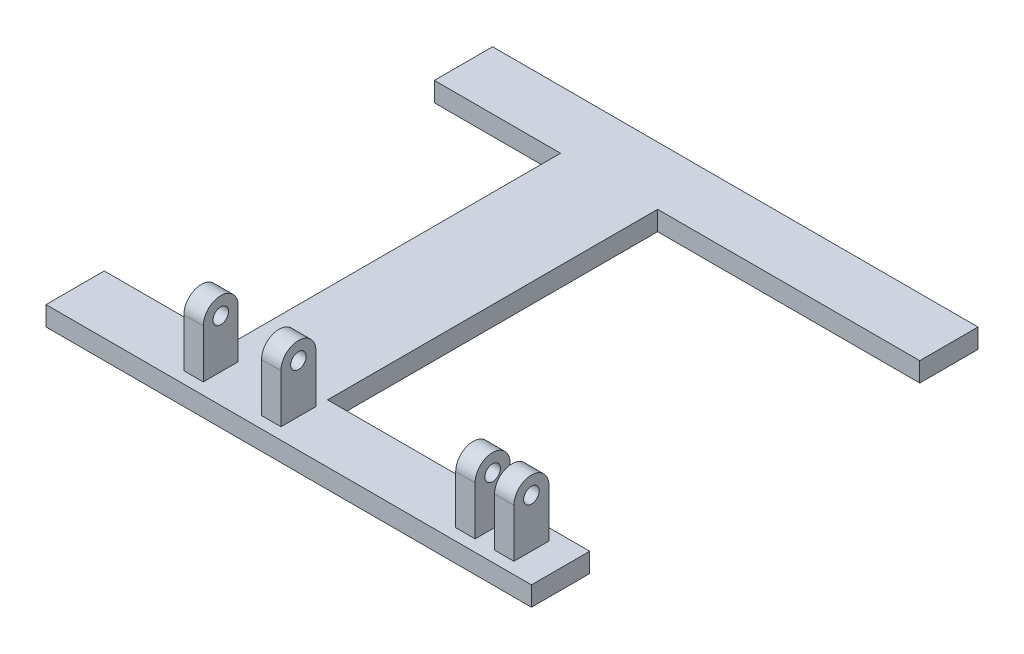
ISO-10303-21;
HEADER;
FILE_DESCRIPTION(('STEP AP214'),'2;1');
FILE_NAME('part.step','',(''),(''),'','','');
FILE_SCHEMA(('AUTOMOTIVE_DESIGN { 1 0 10303 214 1 1 1 1 }'));
ENDSEC;
DATA;
#1=APPLICATION_CONTEXT('core data for automotive mechanical design processes');
#2=APPLICATION_PROTOCOL_DEFINITION('international standard','automotive_design',2000,#1);
#3=PRODUCT_CONTEXT('',#1,'mechanical');
#4=PRODUCT('Part','Part','',(#3));
#5=PRODUCT_RELATED_PRODUCT_CATEGORY('part','',(#4));
#6=PRODUCT_DEFINITION_FORMATION('','',#4);
#7=PRODUCT_DEFINITION_CONTEXT('part definition',#1,'design');
#8=PRODUCT_DEFINITION('design','',#6,#7);
#9=PRODUCT_DEFINITION_SHAPE('','',#8);
#10=(LENGTH_UNIT() NAMED_UNIT(*) SI_UNIT(.MILLI.,.METRE.));
#11=(NAMED_UNIT(*) PLANE_ANGLE_UNIT() SI_UNIT($,.RADIAN.));
#12=(NAMED_UNIT(*) SI_UNIT($,.STERADIAN.) SOLID_ANGLE_UNIT());
#13=UNCERTAINTY_MEASURE_WITH_UNIT(LENGTH_MEASURE(1.E-05),#10,'distance_accuracy_value','');
#14=(GEOMETRIC_REPRESENTATION_CONTEXT(3) GLOBAL_UNCERTAINTY_ASSIGNED_CONTEXT((#13)) GLOBAL_UNIT_ASSIGNED_CONTEXT((#10,
#11,#12)) REPRESENTATION_CONTEXT('',''));
#15=CARTESIAN_POINT('',(0.,0.,0.));
#16=DIRECTION('',(0.,0.,1.));
#17=DIRECTION('',(1.,0.,0.));
#18=AXIS2_PLACEMENT_3D('',#15,#16,#17);
#19=CARTESIAN_POINT('',(0.,10.,0.));
#20=DIRECTION('',(0.,-1.,0.));
#21=DIRECTION('',(0.,0.,-1.));
#22=AXIS2_PLACEMENT_3D('',#19,#20,#21);
#23=PLANE('',#22);
#24=DIRECTION('',(0.,0.,1.));
#25=VECTOR('',#24,1.);
#26=CARTESIAN_POINT('',(90.,10.,115.450830395274));
#27=LINE('',#26,#25);
#28=CARTESIAN_POINT('',(90.,10.,115.450830395274));
#29=VERTEX_POINT('',#28);
#30=CARTESIAN_POINT('',(90.,10.,133.450830395274));
#31=VERTEX_POINT('',#30);
#32=EDGE_CURVE('E278',#29,#31,#27,.T.);
#33=ORIENTED_EDGE('',*,*,#32,.T.);
#34=DIRECTION('',(-1.,0.,0.));
#35=VECTOR('',#34,1.);
#36=CARTESIAN_POINT('',(90.,10.,133.450830395274));
#37=LINE('',#36,#35);
#38=CARTESIAN_POINT('',(80.,10.,133.450830395274));
#39=VERTEX_POINT('',#38);
#40=EDGE_CURVE('E294',#31,#39,#37,.T.);
#41=ORIENTED_EDGE('',*,*,#40,.T.);
#42=DIRECTION('',(0.,0.,1.));
#43=VECTOR('',#42,1.);
#44=CARTESIAN_POINT('',(80.,10.,115.450830395274));
#45=LINE('',#44,#43);
#46=CARTESIAN_POINT('',(80.,10.,115.450830395274));
#47=VERTEX_POINT('',#46);
#48=EDGE_CURVE('E287',#47,#39,#45,.T.);
#49=ORIENTED_EDGE('',*,*,#48,.F.);
#50=DIRECTION('',(-1.,0.,0.));
#51=VECTOR('',#50,1.);
#52=CARTESIAN_POINT('',(90.,10.,115.450830395274));
#53=LINE('',#52,#51);
#54=EDGE_CURVE('E297',#29,#47,#53,.T.);
#55=ORIENTED_EDGE('',*,*,#54,.F.);
#56=EDGE_LOOP('',(#33,#41,#49,#55));
#57=FACE_BOUND('',#56,.T.);
#58=DIRECTION('',(0.,0.,1.));
#59=VECTOR('',#58,1.);
#60=CARTESIAN_POINT('',(-50.,10.,115.450830395274));
#61=LINE('',#60,#59);
#62=CARTESIAN_POINT('',(-50.,10.,115.450830395274));
#63=VERTEX_POINT('',#62);
#64=CARTESIAN_POINT('',(-50.,10.,133.450830395274));
#65=VERTEX_POINT('',#64);
#66=EDGE_CURVE('E351',#63,#65,#61,.T.);
#67=ORIENTED_EDGE('',*,*,#66,.T.);
#68=DIRECTION('',(-1.,0.,0.));
#69=VECTOR('',#68,1.);
#70=CARTESIAN_POINT('',(-50.,10.,133.450830395274));
#71=LINE('',#70,#69);
#72=CARTESIAN_POINT('',(-60.,10.,133.450830395274));
#73=VERTEX_POINT('',#72);
#74=EDGE_CURVE('E369',#65,#73,#71,.T.);
#75=ORIENTED_EDGE('',*,*,#74,.T.);
#76=DIRECTION('',(0.,0.,1.));
#77=VECTOR('',#76,1.);
#78=CARTESIAN_POINT('',(-60.,10.,115.450830395274));
#79=LINE('',#78,#77);
#80=CARTESIAN_POINT('',(-60.,10.,115.450830395274));
#81=VERTEX_POINT('',#80);
#82=EDGE_CURVE('E362',#81,#73,#79,.T.);
#83=ORIENTED_EDGE('',*,*,#82,.F.);
#84=DIRECTION('',(-1.,0.,0.));
#85=VECTOR('',#84,1.);
#86=CARTESIAN_POINT('',(-50.,10.,115.450830395274));
#87=LINE('',#86,#85);
#88=EDGE_CURVE('E372',#63,#81,#87,.T.);
#89=ORIENTED_EDGE('',*,*,#88,.F.);
#90=EDGE_LOOP('',(#67,#75,#83,#89));
#91=FACE_BOUND('',#90,.T.);
#92=DIRECTION('',(0.,0.,1.));
#93=VECTOR('',#92,1.);
#94=CARTESIAN_POINT('',(-125.,10.,-60.5491696047262));
#95=LINE('',#94,#93);
#96=CARTESIAN_POINT('',(-125.,10.,-90.5491696047262));
#97=VERTEX_POINT('',#96);
#98=CARTESIAN_POINT('',(-125.,10.,-60.5491696047262));
#99=VERTEX_POINT('',#98);
#100=EDGE_CURVE('E376',#97,#99,#95,.T.);
#101=ORIENTED_EDGE('',*,*,#100,.T.);
#102=DIRECTION('',(1.,0.,0.));
#103=VECTOR('',#102,1.);
#104=CARTESIAN_POINT('',(-60.,10.,-60.5491696047262));
#105=LINE('',#104,#103);
#106=CARTESIAN_POINT('',(-60.,10.,-60.5491696047262));
#107=VERTEX_POINT('',#106);
#108=EDGE_CURVE('E379',#99,#107,#105,.T.);
#109=ORIENTED_EDGE('',*,*,#108,.T.);
#110=DIRECTION('',(0.,0.,1.));
#111=VECTOR('',#110,1.);
#112=CARTESIAN_POINT('',(-60.,10.,-60.5491696047262));
#113=LINE('',#112,#111);
#114=CARTESIAN_POINT('',(-60.,10.,109.450830395274));
#115=VERTEX_POINT('',#114);
#116=EDGE_CURVE('E382',#107,#115,#113,.T.);
#117=ORIENTED_EDGE('',*,*,#116,.T.);
#118=DIRECTION('',(-1.,0.,0.));
#119=VECTOR('',#118,1.);
#120=CARTESIAN_POINT('',(-125.,10.,109.450830395274));
#121=LINE('',#120,#119);
#122=CARTESIAN_POINT('',(-125.,10.,109.450830395274));
#123=VERTEX_POINT('',#122);
#124=EDGE_CURVE('E384',#115,#123,#121,.T.);
#125=ORIENTED_EDGE('',*,*,#124,.T.);
#126=DIRECTION('',(0.,0.,1.));
#127=VECTOR('',#126,1.);
#128=CARTESIAN_POINT('',(-125.,10.,139.450830395274));
#129=LINE('',#128,#127);
#130=CARTESIAN_POINT('',(-125.,10.,139.450830395274));
#131=VERTEX_POINT('',#130);
#132=EDGE_CURVE('E386',#123,#131,#129,.T.);
#133=ORIENTED_EDGE('',*,*,#132,.T.);
#134=DIRECTION('',(1.,0.,0.));
#135=VECTOR('',#134,1.);
#136=CARTESIAN_POINT('',(125.,10.,139.450830395274));
#137=LINE('',#136,#135);
#138=CARTESIAN_POINT('',(125.,10.,139.450830395274));
#139=VERTEX_POINT('',#138);
#140=EDGE_CURVE('E388',#131,#139,#137,.T.);
#141=ORIENTED_EDGE('',*,*,#140,.T.);
#142=DIRECTION('',(0.,0.,-1.));
#143=VECTOR('',#142,1.);
#144=CARTESIAN_POINT('',(125.,10.,109.450830395274));
#145=LINE('',#144,#143);
#146=CARTESIAN_POINT('',(125.,10.,109.450830395274));
#147=VERTEX_POINT('',#146);
#148=EDGE_CURVE('E390',#139,#147,#145,.T.);
#149=ORIENTED_EDGE('',*,*,#148,.T.);
#150=DIRECTION('',(-1.,0.,0.));
#151=VECTOR('',#150,1.);
#152=CARTESIAN_POINT('',(-9.99999999999995,10.,109.450830395274));
#153=LINE('',#152,#151);
#154=CARTESIAN_POINT('',(-9.99999999999995,10.,109.450830395274));
#155=VERTEX_POINT('',#154);
#156=EDGE_CURVE('E392',#147,#155,#153,.T.);
#157=ORIENTED_EDGE('',*,*,#156,.T.);
#158=DIRECTION('',(0.,0.,-1.));
#159=VECTOR('',#158,1.);
#160=CARTESIAN_POINT('',(-9.99999999999997,10.,-60.5491696047262));
#161=LINE('',#160,#159);
#162=CARTESIAN_POINT('',(-9.99999999999997,10.,-60.5491696047262));
#163=VERTEX_POINT('',#162);
#164=EDGE_CURVE('E394',#155,#163,#161,.T.);
#165=ORIENTED_EDGE('',*,*,#164,.T.);
#166=DIRECTION('',(1.,0.,0.));
#167=VECTOR('',#166,1.);
#168=CARTESIAN_POINT('',(125.,10.,-60.5491696047262));
#169=LINE('',#168,#167);
#170=CARTESIAN_POINT('',(125.,10.,-60.5491696047262));
#171=VERTEX_POINT('',#170);
#172=EDGE_CURVE('E396',#163,#171,#169,.T.);
#173=ORIENTED_EDGE('',*,*,#172,.T.);
#174=DIRECTION('',(0.,0.,-1.));
#175=VECTOR('',#174,1.);
#176=CARTESIAN_POINT('',(125.,10.,-90.5491696047262));
#177=LINE('',#176,#175);
#178=CARTESIAN_POINT('',(125.,10.,-90.5491696047262));
#179=VERTEX_POINT('',#178);
#180=EDGE_CURVE('E398',#171,#179,#177,.T.);
#181=ORIENTED_EDGE('',*,*,#180,.T.);
#182=DIRECTION('',(-1.,0.,0.));
#183=VECTOR('',#182,1.);
#184=CARTESIAN_POINT('',(-125.,10.,-90.5491696047262));
#185=LINE('',#184,#183);
#186=EDGE_CURVE('E400',#179,#97,#185,.T.);
#187=ORIENTED_EDGE('',*,*,#186,.T.);
#188=EDGE_LOOP('',(#101,#109,#117,#125,#133,#141,#149,#157,#165,#173,#181,#187));
#189=FACE_BOUND('',#188,.T.);
#190=DIRECTION('',(0.,0.,1.));
#191=VECTOR('',#190,1.);
#192=CARTESIAN_POINT('',(-9.99999999999998,10.,115.450830395274));
#193=LINE('',#192,#191);
#194=CARTESIAN_POINT('',(-9.99999999999998,10.,115.450830395274));
#195=VERTEX_POINT('',#194);
#196=CARTESIAN_POINT('',(-9.99999999999997,10.,133.450830395274));
#197=VERTEX_POINT('',#196);
#198=EDGE_CURVE('E313',#195,#197,#193,.T.);
#199=ORIENTED_EDGE('',*,*,#198,.T.);
#200=DIRECTION('',(-1.,0.,0.));
#201=VECTOR('',#200,1.);
#202=CARTESIAN_POINT('',(-9.99999999999997,10.,133.450830395274));
#203=LINE('',#202,#201);
#204=CARTESIAN_POINT('',(-20.,10.,133.450830395274));
#205=VERTEX_POINT('',#204);
#206=EDGE_CURVE('E331',#197,#205,#203,.T.);
#207=ORIENTED_EDGE('',*,*,#206,.T.);
#208=DIRECTION('',(0.,0.,1.));
#209=VECTOR('',#208,1.);
#210=CARTESIAN_POINT('',(-20.,10.,115.450830395274));
#211=LINE('',#210,#209);
#212=CARTESIAN_POINT('',(-20.,10.,115.450830395274));
#213=VERTEX_POINT('',#212);
#214=EDGE_CURVE('E324',#213,#205,#211,.T.);
#215=ORIENTED_EDGE('',*,*,#214,.F.);
#216=DIRECTION('',(-1.,0.,0.));
#217=VECTOR('',#216,1.);
#218=CARTESIAN_POINT('',(-9.99999999999998,10.,115.450830395274));
#219=LINE('',#218,#217);
#220=EDGE_CURVE('E334',#195,#213,#219,.T.);
#221=ORIENTED_EDGE('',*,*,#220,.F.);
#222=EDGE_LOOP('',(#199,#207,#215,#221));
#223=FACE_BOUND('',#222,.T.);
#224=DIRECTION('',(0.,0.,1.));
#225=VECTOR('',#224,1.);
#226=CARTESIAN_POINT('',(110.,10.,115.450830395274));
#227=LINE('',#226,#225);
#228=CARTESIAN_POINT('',(110.,10.,115.450830395274));
#229=VERTEX_POINT('',#228);
#230=CARTESIAN_POINT('',(110.,10.,133.450830395274));
#231=VERTEX_POINT('',#230);
#232=EDGE_CURVE('E239',#229,#231,#227,.T.);
#233=ORIENTED_EDGE('',*,*,#232,.T.);
#234=DIRECTION('',(-1.,0.,0.));
#235=VECTOR('',#234,1.);
#236=CARTESIAN_POINT('',(110.,10.,133.450830395274));
#237=LINE('',#236,#235);
#238=CARTESIAN_POINT('',(100.,10.,133.450830395274));
#239=VERTEX_POINT('',#238);
#240=EDGE_CURVE('E261',#231,#239,#237,.T.);
#241=ORIENTED_EDGE('',*,*,#240,.T.);
#242=DIRECTION('',(0.,0.,1.));
#243=VECTOR('',#242,1.);
#244=CARTESIAN_POINT('',(100.,10.,115.450830395274));
#245=LINE('',#244,#243);
#246=CARTESIAN_POINT('',(100.,10.,115.450830395274));
#247=VERTEX_POINT('',#246);
#248=EDGE_CURVE('E246',#247,#239,#245,.T.);
#249=ORIENTED_EDGE('',*,*,#248,.F.);
#250=DIRECTION('',(-1.,0.,0.));
#251=VECTOR('',#250,1.);
#252=CARTESIAN_POINT('',(110.,10.,115.450830395274));
#253=LINE('',#252,#251);
#254=EDGE_CURVE('E229',#229,#247,#253,.T.);
#255=ORIENTED_EDGE('',*,*,#254,.F.);
#256=EDGE_LOOP('',(#233,#241,#249,#255));
#257=FACE_BOUND('',#256,.T.);
#258=ADVANCED_FACE('F35',(#57,#91,#189,#223,#257),#23,.F.);
#259=CARTESIAN_POINT('',(-125.,10.,-60.5491696047262));
#260=DIRECTION('',(1.,0.,0.));
#261=DIRECTION('',(0.,0.,-1.));
#262=AXIS2_PLACEMENT_3D('',#259,#260,#261);
#263=PLANE('',#262);
#264=DIRECTION('',(0.,0.,1.));
#265=VECTOR('',#264,1.);
#266=CARTESIAN_POINT('',(-125.,0.,-60.5491696047262));
#267=LINE('',#266,#265);
#268=CARTESIAN_POINT('',(-125.,0.,-90.5491696047262));
#269=VERTEX_POINT('',#268);
#270=CARTESIAN_POINT('',(-125.,0.,-60.5491696047262));
#271=VERTEX_POINT('',#270);
#272=EDGE_CURVE('E368',#269,#271,#267,.T.);
#273=ORIENTED_EDGE('',*,*,#272,.T.);
#274=DIRECTION('',(0.,-1.,0.));
#275=VECTOR('',#274,1.);
#276=CARTESIAN_POINT('',(-125.,10.,-60.5491696047262));
#277=LINE('',#276,#275);
#278=EDGE_CURVE('E11',#99,#271,#277,.T.);
#279=ORIENTED_EDGE('',*,*,#278,.F.);
#280=ORIENTED_EDGE('',*,*,#100,.F.);
#281=DIRECTION('',(0.,-1.,0.));
#282=VECTOR('',#281,1.);
#283=CARTESIAN_POINT('',(-125.,10.,-90.5491696047262));
#284=LINE('',#283,#282);
#285=EDGE_CURVE('E402',#97,#269,#284,.T.);
#286=ORIENTED_EDGE('',*,*,#285,.T.);
#287=EDGE_LOOP('',(#273,#279,#280,#286));
#288=FACE_BOUND('',#287,.T.);
#289=ADVANCED_FACE('F37',(#288),#263,.F.);
#290=CARTESIAN_POINT('',(-60.,10.,-60.5491696047262));
#291=DIRECTION('',(0.,0.,-1.));
#292=DIRECTION('',(-1.,0.,0.));
#293=AXIS2_PLACEMENT_3D('',#290,#291,#292);
#294=PLANE('',#293);
#295=DIRECTION('',(1.,0.,0.));
#296=VECTOR('',#295,1.);
#297=CARTESIAN_POINT('',(-60.,0.,-60.5491696047262));
#298=LINE('',#297,#296);
#299=CARTESIAN_POINT('',(-60.,0.,-60.5491696047262));
#300=VERTEX_POINT('',#299);
#301=EDGE_CURVE('E405',#271,#300,#298,.T.);
#302=ORIENTED_EDGE('',*,*,#301,.T.);
#303=DIRECTION('',(0.,-1.,0.));
#304=VECTOR('',#303,1.);
#305=CARTESIAN_POINT('',(-60.,10.,-60.5491696047262));
#306=LINE('',#305,#304);
#307=EDGE_CURVE('E43',#107,#300,#306,.T.);
#308=ORIENTED_EDGE('',*,*,#307,.F.);
#309=ORIENTED_EDGE('',*,*,#108,.F.);
#310=ORIENTED_EDGE('',*,*,#278,.T.);
#311=EDGE_LOOP('',(#302,#308,#309,#310));
#312=FACE_BOUND('',#311,.T.);
#313=ADVANCED_FACE('F482',(#312),#294,.F.);
#314=CARTESIAN_POINT('',(-60.,10.,-60.5491696047262));
#315=DIRECTION('',(1.,0.,0.));
#316=DIRECTION('',(0.,0.,-1.));
#317=AXIS2_PLACEMENT_3D('',#314,#315,#316);
#318=PLANE('',#317);
#319=DIRECTION('',(0.,0.,1.));
#320=VECTOR('',#319,1.);
#321=CARTESIAN_POINT('',(-60.,0.,-60.5491696047262));
#322=LINE('',#321,#320);
#323=CARTESIAN_POINT('',(-60.,0.,109.450830395274));
#324=VERTEX_POINT('',#323);
#325=EDGE_CURVE('E407',#300,#324,#322,.T.);
#326=ORIENTED_EDGE('',*,*,#325,.T.);
#327=DIRECTION('',(0.,-1.,0.));
#328=VECTOR('',#327,1.);
#329=CARTESIAN_POINT('',(-60.,10.,109.450830395274));
#330=LINE('',#329,#328);
#331=EDGE_CURVE('E452',#115,#324,#330,.T.);
#332=ORIENTED_EDGE('',*,*,#331,.F.);
#333=ORIENTED_EDGE('',*,*,#116,.F.);
#334=ORIENTED_EDGE('',*,*,#307,.T.);
#335=EDGE_LOOP('',(#326,#332,#333,#334));
#336=FACE_BOUND('',#335,.T.);
#337=ADVANCED_FACE('F459',(#336),#318,.F.);
#338=CARTESIAN_POINT('',(-125.,10.,109.450830395274));
#339=DIRECTION('',(0.,0.,1.));
#340=DIRECTION('',(1.,0.,0.));
#341=AXIS2_PLACEMENT_3D('',#338,#339,#340);
#342=PLANE('',#341);
#343=DIRECTION('',(-1.,0.,0.));
#344=VECTOR('',#343,1.);
#345=CARTESIAN_POINT('',(-125.,0.,109.450830395274));
#346=LINE('',#345,#344);
#347=CARTESIAN_POINT('',(-125.,0.,109.450830395274));
#348=VERTEX_POINT('',#347);
#349=EDGE_CURVE('E409',#324,#348,#346,.T.);
#350=ORIENTED_EDGE('',*,*,#349,.T.);
#351=DIRECTION('',(0.,-1.,0.));
#352=VECTOR('',#351,1.);
#353=CARTESIAN_POINT('',(-125.,10.,109.450830395274));
#354=LINE('',#353,#352);
#355=EDGE_CURVE('E449',#123,#348,#354,.T.);
#356=ORIENTED_EDGE('',*,*,#355,.F.);
#357=ORIENTED_EDGE('',*,*,#124,.F.);
#358=ORIENTED_EDGE('',*,*,#331,.T.);
#359=EDGE_LOOP('',(#350,#356,#357,#358));
#360=FACE_BOUND('',#359,.T.);
#361=ADVANCED_FACE('F470',(#360),#342,.F.);
#362=CARTESIAN_POINT('',(-125.,10.,139.450830395274));
#363=DIRECTION('',(1.,0.,0.));
#364=DIRECTION('',(0.,0.,-1.));
#365=AXIS2_PLACEMENT_3D('',#362,#363,#364);
#366=PLANE('',#365);
#367=DIRECTION('',(0.,0.,1.));
#368=VECTOR('',#367,1.);
#369=CARTESIAN_POINT('',(-125.,0.,139.450830395274));
#370=LINE('',#369,#368);
#371=CARTESIAN_POINT('',(-125.,0.,139.450830395274));
#372=VERTEX_POINT('',#371);
#373=EDGE_CURVE('E411',#348,#372,#370,.T.);
#374=ORIENTED_EDGE('',*,*,#373,.T.);
#375=DIRECTION('',(0.,-1.,0.));
#376=VECTOR('',#375,1.);
#377=CARTESIAN_POINT('',(-125.,10.,139.450830395274));
#378=LINE('',#377,#376);
#379=EDGE_CURVE('E446',#131,#372,#378,.T.);
#380=ORIENTED_EDGE('',*,*,#379,.F.);
#381=ORIENTED_EDGE('',*,*,#132,.F.);
#382=ORIENTED_EDGE('',*,*,#355,.T.);
#383=EDGE_LOOP('',(#374,#380,#381,#382));
#384=FACE_BOUND('',#383,.T.);
#385=ADVANCED_FACE('F474',(#384),#366,.F.);
#386=CARTESIAN_POINT('',(125.,10.,139.450830395274));
#387=DIRECTION('',(0.,0.,-1.));
#388=DIRECTION('',(-1.,0.,0.));
#389=AXIS2_PLACEMENT_3D('',#386,#387,#388);
#390=PLANE('',#389);
#391=DIRECTION('',(1.,0.,0.));
#392=VECTOR('',#391,1.);
#393=CARTESIAN_POINT('',(125.,0.,139.450830395274));
#394=LINE('',#393,#392);
#395=CARTESIAN_POINT('',(125.,0.,139.450830395274));
#396=VERTEX_POINT('',#395);
#397=EDGE_CURVE('E413',#372,#396,#394,.T.);
#398=ORIENTED_EDGE('',*,*,#397,.T.);
#399=DIRECTION('',(0.,-1.,0.));
#400=VECTOR('',#399,1.);
#401=CARTESIAN_POINT('',(125.,10.,139.450830395274));
#402=LINE('',#401,#400);
#403=EDGE_CURVE('E443',#139,#396,#402,.T.);
#404=ORIENTED_EDGE('',*,*,#403,.F.);
#405=ORIENTED_EDGE('',*,*,#140,.F.);
#406=ORIENTED_EDGE('',*,*,#379,.T.);
#407=EDGE_LOOP('',(#398,#404,#405,#406));
#408=FACE_BOUND('',#407,.T.);
#409=ADVANCED_FACE('F515',(#408),#390,.F.);
#410=CARTESIAN_POINT('',(125.,10.,109.450830395274));
#411=DIRECTION('',(-1.,0.,0.));
#412=DIRECTION('',(0.,0.,1.));
#413=AXIS2_PLACEMENT_3D('',#410,#411,#412);
#414=PLANE('',#413);
#415=DIRECTION('',(0.,0.,-1.));
#416=VECTOR('',#415,1.);
#417=CARTESIAN_POINT('',(125.,0.,109.450830395274));
#418=LINE('',#417,#416);
#419=CARTESIAN_POINT('',(125.,0.,109.450830395274));
#420=VERTEX_POINT('',#419);
#421=EDGE_CURVE('E415',#396,#420,#418,.T.);
#422=ORIENTED_EDGE('',*,*,#421,.T.);
#423=DIRECTION('',(0.,-1.,0.));
#424=VECTOR('',#423,1.);
#425=CARTESIAN_POINT('',(125.,10.,109.450830395274));
#426=LINE('',#425,#424);
#427=EDGE_CURVE('E440',#147,#420,#426,.T.);
#428=ORIENTED_EDGE('',*,*,#427,.F.);
#429=ORIENTED_EDGE('',*,*,#148,.F.);
#430=ORIENTED_EDGE('',*,*,#403,.T.);
#431=EDGE_LOOP('',(#422,#428,#429,#430));
#432=FACE_BOUND('',#431,.T.);
#433=ADVANCED_FACE('F513',(#432),#414,.F.);
#434=CARTESIAN_POINT('',(-9.99999999999995,10.,109.450830395274));
#435=DIRECTION('',(0.,0.,1.));
#436=DIRECTION('',(1.,0.,0.));
#437=AXIS2_PLACEMENT_3D('',#434,#435,#436);
#438=PLANE('',#437);
#439=DIRECTION('',(-1.,0.,0.));
#440=VECTOR('',#439,1.);
#441=CARTESIAN_POINT('',(-9.99999999999995,0.,109.450830395274));
#442=LINE('',#441,#440);
#443=CARTESIAN_POINT('',(-9.99999999999995,0.,109.450830395274));
#444=VERTEX_POINT('',#443);
#445=EDGE_CURVE('E417',#420,#444,#442,.T.);
#446=ORIENTED_EDGE('',*,*,#445,.T.);
#447=DIRECTION('',(0.,-1.,0.));
#448=VECTOR('',#447,1.);
#449=CARTESIAN_POINT('',(-9.99999999999995,10.,109.450830395274));
#450=LINE('',#449,#448);
#451=EDGE_CURVE('E437',#155,#444,#450,.T.);
#452=ORIENTED_EDGE('',*,*,#451,.F.);
#453=ORIENTED_EDGE('',*,*,#156,.F.);
#454=ORIENTED_EDGE('',*,*,#427,.T.);
#455=EDGE_LOOP('',(#446,#452,#453,#454));
#456=FACE_BOUND('',#455,.T.);
#457=ADVANCED_FACE('F509',(#456),#438,.F.);
#458=CARTESIAN_POINT('',(-9.99999999999997,10.,-60.5491696047262));
#459=DIRECTION('',(-1.,0.,0.));
#460=DIRECTION('',(0.,0.,1.));
#461=AXIS2_PLACEMENT_3D('',#458,#459,#460);
#462=PLANE('',#461);
#463=DIRECTION('',(0.,0.,-1.));
#464=VECTOR('',#463,1.);
#465=CARTESIAN_POINT('',(-9.99999999999997,0.,-60.5491696047262));
#466=LINE('',#465,#464);
#467=CARTESIAN_POINT('',(-9.99999999999997,0.,-60.5491696047262));
#468=VERTEX_POINT('',#467);
#469=EDGE_CURVE('E419',#444,#468,#466,.T.);
#470=ORIENTED_EDGE('',*,*,#469,.T.);
#471=DIRECTION('',(0.,-1.,0.));
#472=VECTOR('',#471,1.);
#473=CARTESIAN_POINT('',(-9.99999999999997,10.,-60.5491696047262));
#474=LINE('',#473,#472);
#475=EDGE_CURVE('E434',#163,#468,#474,.T.);
#476=ORIENTED_EDGE('',*,*,#475,.F.);
#477=ORIENTED_EDGE('',*,*,#164,.F.);
#478=ORIENTED_EDGE('',*,*,#451,.T.);
#479=EDGE_LOOP('',(#470,#476,#477,#478));
#480=FACE_BOUND('',#479,.T.);
#481=ADVANCED_FACE('F504',(#480),#462,.F.);
#482=CARTESIAN_POINT('',(125.,10.,-60.5491696047262));
#483=DIRECTION('',(0.,0.,-1.));
#484=DIRECTION('',(-1.,0.,0.));
#485=AXIS2_PLACEMENT_3D('',#482,#483,#484);
#486=PLANE('',#485);
#487=DIRECTION('',(1.,0.,0.));
#488=VECTOR('',#487,1.);
#489=CARTESIAN_POINT('',(125.,0.,-60.5491696047262));
#490=LINE('',#489,#488);
#491=CARTESIAN_POINT('',(125.,0.,-60.5491696047262));
#492=VERTEX_POINT('',#491);
#493=EDGE_CURVE('E421',#468,#492,#490,.T.);
#494=ORIENTED_EDGE('',*,*,#493,.T.);
#495=DIRECTION('',(0.,-1.,0.));
#496=VECTOR('',#495,1.);
#497=CARTESIAN_POINT('',(125.,10.,-60.5491696047262));
#498=LINE('',#497,#496);
#499=EDGE_CURVE('E431',#171,#492,#498,.T.);
#500=ORIENTED_EDGE('',*,*,#499,.F.);
#501=ORIENTED_EDGE('',*,*,#172,.F.);
#502=ORIENTED_EDGE('',*,*,#475,.T.);
#503=EDGE_LOOP('',(#494,#500,#501,#502));
#504=FACE_BOUND('',#503,.T.);
#505=ADVANCED_FACE('F498',(#504),#486,.F.);
#506=CARTESIAN_POINT('',(125.,10.,-90.5491696047262));
#507=DIRECTION('',(-1.,0.,0.));
#508=DIRECTION('',(0.,0.,1.));
#509=AXIS2_PLACEMENT_3D('',#506,#507,#508);
#510=PLANE('',#509);
#511=DIRECTION('',(0.,0.,-1.));
#512=VECTOR('',#511,1.);
#513=CARTESIAN_POINT('',(125.,0.,-90.5491696047262));
#514=LINE('',#513,#512);
#515=CARTESIAN_POINT('',(125.,0.,-90.5491696047262));
#516=VERTEX_POINT('',#515);
#517=EDGE_CURVE('E423',#492,#516,#514,.T.);
#518=ORIENTED_EDGE('',*,*,#517,.T.);
#519=DIRECTION('',(0.,-1.,0.));
#520=VECTOR('',#519,1.);
#521=CARTESIAN_POINT('',(125.,10.,-90.5491696047262));
#522=LINE('',#521,#520);
#523=EDGE_CURVE('E428',#179,#516,#522,.T.);
#524=ORIENTED_EDGE('',*,*,#523,.F.);
#525=ORIENTED_EDGE('',*,*,#180,.F.);
#526=ORIENTED_EDGE('',*,*,#499,.T.);
#527=EDGE_LOOP('',(#518,#524,#525,#526));
#528=FACE_BOUND('',#527,.T.);
#529=ADVANCED_FACE('F494',(#528),#510,.F.);
#530=CARTESIAN_POINT('',(-125.,10.,-90.5491696047262));
#531=DIRECTION('',(0.,0.,1.));
#532=DIRECTION('',(1.,0.,0.));
#533=AXIS2_PLACEMENT_3D('',#530,#531,#532);
#534=PLANE('',#533);
#535=DIRECTION('',(-1.,0.,0.));
#536=VECTOR('',#535,1.);
#537=CARTESIAN_POINT('',(-125.,0.,-90.5491696047262));
#538=LINE('',#537,#536);
#539=EDGE_CURVE('E380',#516,#269,#538,.T.);
#540=ORIENTED_EDGE('',*,*,#539,.T.);
#541=ORIENTED_EDGE('',*,*,#285,.F.);
#542=ORIENTED_EDGE('',*,*,#186,.F.);
#543=ORIENTED_EDGE('',*,*,#523,.T.);
#544=EDGE_LOOP('',(#540,#541,#542,#543));
#545=FACE_BOUND('',#544,.T.);
#546=ADVANCED_FACE('F489',(#545),#534,.F.);
#547=CARTESIAN_POINT('',(0.,0.,0.));
#548=DIRECTION('',(0.,-1.,0.));
#549=DIRECTION('',(0.,0.,-1.));
#550=AXIS2_PLACEMENT_3D('',#547,#548,#549);
#551=PLANE('',#550);
#552=ORIENTED_EDGE('',*,*,#272,.F.);
#553=ORIENTED_EDGE('',*,*,#539,.F.);
#554=ORIENTED_EDGE('',*,*,#517,.F.);
#555=ORIENTED_EDGE('',*,*,#493,.F.);
#556=ORIENTED_EDGE('',*,*,#469,.F.);
#557=ORIENTED_EDGE('',*,*,#445,.F.);
#558=ORIENTED_EDGE('',*,*,#421,.F.);
#559=ORIENTED_EDGE('',*,*,#397,.F.);
#560=ORIENTED_EDGE('',*,*,#373,.F.);
#561=ORIENTED_EDGE('',*,*,#349,.F.);
#562=ORIENTED_EDGE('',*,*,#325,.F.);
#563=ORIENTED_EDGE('',*,*,#301,.F.);
#564=EDGE_LOOP('',(#552,#553,#554,#555,#556,#557,#558,#559,#560,#561,#562,#563));
#565=FACE_BOUND('',#564,.T.);
#566=ADVANCED_FACE('F465',(#565),#551,.T.);
#567=CARTESIAN_POINT('',(-50.,35.,124.450830395274));
#568=DIRECTION('',(-1.,0.,0.));
#569=DIRECTION('',(0.,0.,1.));
#570=AXIS2_PLACEMENT_3D('',#567,#568,#569);
#571=CYLINDRICAL_SURFACE('',#570,8.99999999999999);
#572=CARTESIAN_POINT('',(-60.,35.,124.450830395274));
#573=DIRECTION('',(-1.,0.,0.));
#574=DIRECTION('',(0.,0.,1.));
#575=AXIS2_PLACEMENT_3D('',#572,#573,#574);
#576=CIRCLE('',#575,8.99999999999999);
#577=CARTESIAN_POINT('',(-60.,35.,133.450830395274));
#578=VERTEX_POINT('',#577);
#579=CARTESIAN_POINT('',(-60.,35.,115.450830395274));
#580=VERTEX_POINT('',#579);
#581=EDGE_CURVE('E341',#578,#580,#576,.T.);
#582=ORIENTED_EDGE('',*,*,#581,.F.);
#583=DIRECTION('',(-1.,0.,0.));
#584=VECTOR('',#583,1.);
#585=CARTESIAN_POINT('',(-50.,35.,133.450830395274));
#586=LINE('',#585,#584);
#587=CARTESIAN_POINT('',(-50.,35.,133.450830395274));
#588=VERTEX_POINT('',#587);
#589=EDGE_CURVE('E366',#588,#578,#586,.T.);
#590=ORIENTED_EDGE('',*,*,#589,.F.);
#591=CARTESIAN_POINT('',(-50.,35.,124.450830395274));
#592=DIRECTION('',(-1.,0.,0.));
#593=DIRECTION('',(0.,0.,1.));
#594=AXIS2_PLACEMENT_3D('',#591,#592,#593);
#595=CIRCLE('',#594,8.99999999999999);
#596=CARTESIAN_POINT('',(-50.,35.,115.450830395274));
#597=VERTEX_POINT('',#596);
#598=EDGE_CURVE('E344',#588,#597,#595,.T.);
#599=ORIENTED_EDGE('',*,*,#598,.T.);
#600=DIRECTION('',(-1.,0.,0.));
#601=VECTOR('',#600,1.);
#602=CARTESIAN_POINT('',(-50.,35.,115.450830395274));
#603=LINE('',#602,#601);
#604=EDGE_CURVE('E357',#597,#580,#603,.T.);
#605=ORIENTED_EDGE('',*,*,#604,.T.);
#606=EDGE_LOOP('',(#582,#590,#599,#605));
#607=FACE_BOUND('',#606,.T.);
#608=ADVANCED_FACE('F533',(#607),#571,.T.);
#609=CARTESIAN_POINT('',(-50.,35.,133.450830395274));
#610=DIRECTION('',(0.,0.,1.));
#611=DIRECTION('',(1.,0.,0.));
#612=AXIS2_PLACEMENT_3D('',#609,#610,#611);
#613=PLANE('',#612);
#614=DIRECTION('',(0.,1.,0.));
#615=VECTOR('',#614,1.);
#616=CARTESIAN_POINT('',(-60.,35.,133.450830395274));
#617=LINE('',#616,#615);
#618=EDGE_CURVE('E348',#73,#578,#617,.T.);
#619=ORIENTED_EDGE('',*,*,#618,.F.);
#620=ORIENTED_EDGE('',*,*,#74,.F.);
#621=DIRECTION('',(0.,1.,0.));
#622=VECTOR('',#621,1.);
#623=CARTESIAN_POINT('',(-50.,35.,133.450830395274));
#624=LINE('',#623,#622);
#625=EDGE_CURVE('E354',#65,#588,#624,.T.);
#626=ORIENTED_EDGE('',*,*,#625,.T.);
#627=ORIENTED_EDGE('',*,*,#589,.T.);
#628=EDGE_LOOP('',(#619,#620,#626,#627));
#629=FACE_BOUND('',#628,.T.);
#630=ADVANCED_FACE('F576',(#629),#613,.T.);
#631=CARTESIAN_POINT('',(-50.,35.,115.450830395274));
#632=DIRECTION('',(0.,0.,-1.));
#633=DIRECTION('',(-1.,0.,0.));
#634=AXIS2_PLACEMENT_3D('',#631,#632,#633);
#635=PLANE('',#634);
#636=DIRECTION('',(0.,-1.,0.));
#637=VECTOR('',#636,1.);
#638=CARTESIAN_POINT('',(-60.,35.,115.450830395274));
#639=LINE('',#638,#637);
#640=EDGE_CURVE('E360',#580,#81,#639,.T.);
#641=ORIENTED_EDGE('',*,*,#640,.F.);
#642=ORIENTED_EDGE('',*,*,#604,.F.);
#643=DIRECTION('',(0.,-1.,0.));
#644=VECTOR('',#643,1.);
#645=CARTESIAN_POINT('',(-50.,35.,115.450830395274));
#646=LINE('',#645,#644);
#647=EDGE_CURVE('E347',#597,#63,#646,.T.);
#648=ORIENTED_EDGE('',*,*,#647,.T.);
#649=ORIENTED_EDGE('',*,*,#88,.T.);
#650=EDGE_LOOP('',(#641,#642,#648,#649));
#651=FACE_BOUND('',#650,.T.);
#652=ADVANCED_FACE('F583',(#651),#635,.T.);
#653=CARTESIAN_POINT('',(-50.,35.,124.450830395274));
#654=DIRECTION('',(-1.,0.,0.));
#655=DIRECTION('',(0.,0.,1.));
#656=AXIS2_PLACEMENT_3D('',#653,#654,#655);
#657=PLANE('',#656);
#658=CARTESIAN_POINT('',(-50.,35.,124.450830395274));
#659=DIRECTION('',(-1.,0.,0.));
#660=DIRECTION('',(0.,0.,1.));
#661=AXIS2_PLACEMENT_3D('',#658,#659,#660);
#662=CIRCLE('',#661,3.99999999999998);
#663=CARTESIAN_POINT('',(-50.,35.,128.450830395274));
#664=VERTEX_POINT('',#663);
#665=EDGE_CURVE('E338',#664,#664,#662,.T.);
#666=ORIENTED_EDGE('',*,*,#665,.T.);
#667=EDGE_LOOP('',(#666));
#668=FACE_BOUND('',#667,.T.);
#669=ORIENTED_EDGE('',*,*,#598,.F.);
#670=ORIENTED_EDGE('',*,*,#625,.F.);
#671=ORIENTED_EDGE('',*,*,#66,.F.);
#672=ORIENTED_EDGE('',*,*,#647,.F.);
#673=EDGE_LOOP('',(#669,#670,#671,#672));
#674=FACE_BOUND('',#673,.T.);
#675=ADVANCED_FACE('F591',(#668,#674),#657,.F.);
#676=CARTESIAN_POINT('',(-60.,35.,124.450830395274));
#677=DIRECTION('',(-1.,0.,0.));
#678=DIRECTION('',(0.,0.,1.));
#679=AXIS2_PLACEMENT_3D('',#676,#677,#678);
#680=PLANE('',#679);
#681=CARTESIAN_POINT('',(-60.,35.,124.450830395274));
#682=DIRECTION('',(-1.,0.,0.));
#683=DIRECTION('',(0.,0.,1.));
#684=AXIS2_PLACEMENT_3D('',#681,#682,#683);
#685=CIRCLE('',#684,3.99999999999998);
#686=CARTESIAN_POINT('',(-60.,35.,128.450830395274));
#687=VERTEX_POINT('',#686);
#688=EDGE_CURVE('E330',#687,#687,#685,.T.);
#689=ORIENTED_EDGE('',*,*,#688,.F.);
#690=EDGE_LOOP('',(#689));
#691=FACE_BOUND('',#690,.T.);
#692=ORIENTED_EDGE('',*,*,#581,.T.);
#693=ORIENTED_EDGE('',*,*,#640,.T.);
#694=ORIENTED_EDGE('',*,*,#82,.T.);
#695=ORIENTED_EDGE('',*,*,#618,.T.);
#696=EDGE_LOOP('',(#692,#693,#694,#695));
#697=FACE_BOUND('',#696,.T.);
#698=ADVANCED_FACE('F598',(#691,#697),#680,.T.);
#699=CARTESIAN_POINT('',(-50.,35.,124.450830395274));
#700=DIRECTION('',(-1.,0.,0.));
#701=DIRECTION('',(0.,0.,1.));
#702=AXIS2_PLACEMENT_3D('',#699,#700,#701);
#703=CYLINDRICAL_SURFACE('',#702,3.99999999999998);
#704=ORIENTED_EDGE('',*,*,#665,.F.);
#705=EDGE_LOOP('',(#704));
#706=FACE_BOUND('',#705,.T.);
#707=ORIENTED_EDGE('',*,*,#688,.T.);
#708=EDGE_LOOP('',(#707));
#709=FACE_BOUND('',#708,.T.);
#710=ADVANCED_FACE('F606',(#706,#709),#703,.F.);
#711=CARTESIAN_POINT('',(-9.99999999999998,35.,124.450830395274));
#712=DIRECTION('',(-1.,0.,0.));
#713=DIRECTION('',(0.,0.,1.));
#714=AXIS2_PLACEMENT_3D('',#711,#712,#713);
#715=CYLINDRICAL_SURFACE('',#714,8.99999999999999);
#716=CARTESIAN_POINT('',(-20.,35.,124.450830395274));
#717=DIRECTION('',(-1.,0.,0.));
#718=DIRECTION('',(0.,0.,1.));
#719=AXIS2_PLACEMENT_3D('',#716,#717,#718);
#720=CIRCLE('',#719,8.99999999999999);
#721=CARTESIAN_POINT('',(-20.,35.,133.450830395274));
#722=VERTEX_POINT('',#721);
#723=CARTESIAN_POINT('',(-20.,35.,115.450830395274));
#724=VERTEX_POINT('',#723);
#725=EDGE_CURVE('E303',#722,#724,#720,.T.);
#726=ORIENTED_EDGE('',*,*,#725,.F.);
#727=DIRECTION('',(-1.,0.,0.));
#728=VECTOR('',#727,1.);
#729=CARTESIAN_POINT('',(-9.99999999999997,35.,133.450830395274));
#730=LINE('',#729,#728);
#731=CARTESIAN_POINT('',(-9.99999999999997,35.,133.450830395274));
#732=VERTEX_POINT('',#731);
#733=EDGE_CURVE('E328',#732,#722,#730,.T.);
#734=ORIENTED_EDGE('',*,*,#733,.F.);
#735=CARTESIAN_POINT('',(-9.99999999999998,35.,124.450830395274));
#736=DIRECTION('',(-1.,0.,0.));
#737=DIRECTION('',(0.,0.,1.));
#738=AXIS2_PLACEMENT_3D('',#735,#736,#737);
#739=CIRCLE('',#738,8.99999999999999);
#740=CARTESIAN_POINT('',(-9.99999999999998,35.,115.450830395274));
#741=VERTEX_POINT('',#740);
#742=EDGE_CURVE('E306',#732,#741,#739,.T.);
#743=ORIENTED_EDGE('',*,*,#742,.T.);
#744=DIRECTION('',(-1.,0.,0.));
#745=VECTOR('',#744,1.);
#746=CARTESIAN_POINT('',(-9.99999999999998,35.,115.450830395274));
#747=LINE('',#746,#745);
#748=EDGE_CURVE('E319',#741,#724,#747,.T.);
#749=ORIENTED_EDGE('',*,*,#748,.T.);
#750=EDGE_LOOP('',(#726,#734,#743,#749));
#751=FACE_BOUND('',#750,.T.);
#752=ADVANCED_FACE('F614',(#751),#715,.T.);
#753=CARTESIAN_POINT('',(-9.99999999999997,35.,133.450830395274));
#754=DIRECTION('',(0.,0.,1.));
#755=DIRECTION('',(1.,0.,0.));
#756=AXIS2_PLACEMENT_3D('',#753,#754,#755);
#757=PLANE('',#756);
#758=DIRECTION('',(0.,1.,0.));
#759=VECTOR('',#758,1.);
#760=CARTESIAN_POINT('',(-20.,35.,133.450830395274));
#761=LINE('',#760,#759);
#762=EDGE_CURVE('E310',#205,#722,#761,.T.);
#763=ORIENTED_EDGE('',*,*,#762,.F.);
#764=ORIENTED_EDGE('',*,*,#206,.F.);
#765=DIRECTION('',(0.,1.,0.));
#766=VECTOR('',#765,1.);
#767=CARTESIAN_POINT('',(-9.99999999999997,35.,133.450830395274));
#768=LINE('',#767,#766);
#769=EDGE_CURVE('E316',#197,#732,#768,.T.);
#770=ORIENTED_EDGE('',*,*,#769,.T.);
#771=ORIENTED_EDGE('',*,*,#733,.T.);
#772=EDGE_LOOP('',(#763,#764,#770,#771));
#773=FACE_BOUND('',#772,.T.);
#774=ADVANCED_FACE('F622',(#773),#757,.T.);
#775=CARTESIAN_POINT('',(-9.99999999999998,35.,115.450830395274));
#776=DIRECTION('',(0.,0.,-1.));
#777=DIRECTION('',(-1.,0.,0.));
#778=AXIS2_PLACEMENT_3D('',#775,#776,#777);
#779=PLANE('',#778);
#780=DIRECTION('',(0.,-1.,0.));
#781=VECTOR('',#780,1.);
#782=CARTESIAN_POINT('',(-20.,35.,115.450830395274));
#783=LINE('',#782,#781);
#784=EDGE_CURVE('E322',#724,#213,#783,.T.);
#785=ORIENTED_EDGE('',*,*,#784,.F.);
#786=ORIENTED_EDGE('',*,*,#748,.F.);
#787=DIRECTION('',(0.,-1.,0.));
#788=VECTOR('',#787,1.);
#789=CARTESIAN_POINT('',(-9.99999999999998,35.,115.450830395274));
#790=LINE('',#789,#788);
#791=EDGE_CURVE('E309',#741,#195,#790,.T.);
#792=ORIENTED_EDGE('',*,*,#791,.T.);
#793=ORIENTED_EDGE('',*,*,#220,.T.);
#794=EDGE_LOOP('',(#785,#786,#792,#793));
#795=FACE_BOUND('',#794,.T.);
#796=ADVANCED_FACE('F630',(#795),#779,.T.);
#797=CARTESIAN_POINT('',(-9.99999999999998,35.,124.450830395274));
#798=DIRECTION('',(-1.,0.,0.));
#799=DIRECTION('',(0.,0.,1.));
#800=AXIS2_PLACEMENT_3D('',#797,#798,#799);
#801=PLANE('',#800);
#802=CARTESIAN_POINT('',(-9.99999999999998,35.,124.450830395274));
#803=DIRECTION('',(-1.,0.,0.));
#804=DIRECTION('',(0.,0.,1.));
#805=AXIS2_PLACEMENT_3D('',#802,#803,#804);
#806=CIRCLE('',#805,3.99999999999998);
#807=CARTESIAN_POINT('',(-9.99999999999997,35.,128.450830395274));
#808=VERTEX_POINT('',#807);
#809=EDGE_CURVE('E300',#808,#808,#806,.T.);
#810=ORIENTED_EDGE('',*,*,#809,.T.);
#811=EDGE_LOOP('',(#810));
#812=FACE_BOUND('',#811,.T.);
#813=ORIENTED_EDGE('',*,*,#742,.F.);
#814=ORIENTED_EDGE('',*,*,#769,.F.);
#815=ORIENTED_EDGE('',*,*,#198,.F.);
#816=ORIENTED_EDGE('',*,*,#791,.F.);
#817=EDGE_LOOP('',(#813,#814,#815,#816));
#818=FACE_BOUND('',#817,.T.);
#819=ADVANCED_FACE('F638',(#812,#818),#801,.F.);
#820=CARTESIAN_POINT('',(-20.,35.,124.450830395274));
#821=DIRECTION('',(-1.,0.,0.));
#822=DIRECTION('',(0.,0.,1.));
#823=AXIS2_PLACEMENT_3D('',#820,#821,#822);
#824=PLANE('',#823);
#825=CARTESIAN_POINT('',(-20.,35.,124.450830395274));
#826=DIRECTION('',(-1.,0.,0.));
#827=DIRECTION('',(0.,0.,1.));
#828=AXIS2_PLACEMENT_3D('',#825,#826,#827);
#829=CIRCLE('',#828,3.99999999999998);
#830=CARTESIAN_POINT('',(-20.,35.,128.450830395274));
#831=VERTEX_POINT('',#830);
#832=EDGE_CURVE('E293',#831,#831,#829,.T.);
#833=ORIENTED_EDGE('',*,*,#832,.F.);
#834=EDGE_LOOP('',(#833));
#835=FACE_BOUND('',#834,.T.);
#836=ORIENTED_EDGE('',*,*,#725,.T.);
#837=ORIENTED_EDGE('',*,*,#784,.T.);
#838=ORIENTED_EDGE('',*,*,#214,.T.);
#839=ORIENTED_EDGE('',*,*,#762,.T.);
#840=EDGE_LOOP('',(#836,#837,#838,#839));
#841=FACE_BOUND('',#840,.T.);
#842=ADVANCED_FACE('F646',(#835,#841),#824,.T.);
#843=CARTESIAN_POINT('',(-9.99999999999998,35.,124.450830395274));
#844=DIRECTION('',(-1.,0.,0.));
#845=DIRECTION('',(0.,0.,1.));
#846=AXIS2_PLACEMENT_3D('',#843,#844,#845);
#847=CYLINDRICAL_SURFACE('',#846,3.99999999999998);
#848=ORIENTED_EDGE('',*,*,#809,.F.);
#849=EDGE_LOOP('',(#848));
#850=FACE_BOUND('',#849,.T.);
#851=ORIENTED_EDGE('',*,*,#832,.T.);
#852=EDGE_LOOP('',(#851));
#853=FACE_BOUND('',#852,.T.);
#854=ADVANCED_FACE('F654',(#850,#853),#847,.F.);
#855=CARTESIAN_POINT('',(90.,35.,124.450830395274));
#856=DIRECTION('',(-1.,0.,0.));
#857=DIRECTION('',(0.,0.,1.));
#858=AXIS2_PLACEMENT_3D('',#855,#856,#857);
#859=CYLINDRICAL_SURFACE('',#858,8.99999999999999);
#860=CARTESIAN_POINT('',(80.,35.,124.450830395274));
#861=DIRECTION('',(-1.,0.,0.));
#862=DIRECTION('',(0.,0.,1.));
#863=AXIS2_PLACEMENT_3D('',#860,#861,#862);
#864=CIRCLE('',#863,8.99999999999999);
#865=CARTESIAN_POINT('',(80.,35.,133.450830395274));
#866=VERTEX_POINT('',#865);
#867=CARTESIAN_POINT('',(80.,35.,115.450830395274));
#868=VERTEX_POINT('',#867);
#869=EDGE_CURVE('E268',#866,#868,#864,.T.);
#870=ORIENTED_EDGE('',*,*,#869,.F.);
#871=DIRECTION('',(-1.,0.,0.));
#872=VECTOR('',#871,1.);
#873=CARTESIAN_POINT('',(90.,35.,133.450830395274));
#874=LINE('',#873,#872);
#875=CARTESIAN_POINT('',(90.,35.,133.450830395274));
#876=VERTEX_POINT('',#875);
#877=EDGE_CURVE('E291',#876,#866,#874,.T.);
#878=ORIENTED_EDGE('',*,*,#877,.F.);
#879=CARTESIAN_POINT('',(90.,35.,124.450830395274));
#880=DIRECTION('',(-1.,0.,0.));
#881=DIRECTION('',(0.,0.,1.));
#882=AXIS2_PLACEMENT_3D('',#879,#880,#881);
#883=CIRCLE('',#882,8.99999999999999);
#884=CARTESIAN_POINT('',(90.,35.,115.450830395274));
#885=VERTEX_POINT('',#884);
#886=EDGE_CURVE('E271',#876,#885,#883,.T.);
#887=ORIENTED_EDGE('',*,*,#886,.T.);
#888=DIRECTION('',(-1.,0.,0.));
#889=VECTOR('',#888,1.);
#890=CARTESIAN_POINT('',(90.,35.,115.450830395274));
#891=LINE('',#890,#889);
#892=EDGE_CURVE('E284',#885,#868,#891,.T.);
#893=ORIENTED_EDGE('',*,*,#892,.T.);
#894=EDGE_LOOP('',(#870,#878,#887,#893));
#895=FACE_BOUND('',#894,.T.);
#896=ADVANCED_FACE('F662',(#895),#859,.T.);
#897=CARTESIAN_POINT('',(90.,35.,133.450830395274));
#898=DIRECTION('',(0.,0.,1.));
#899=DIRECTION('',(1.,0.,0.));
#900=AXIS2_PLACEMENT_3D('',#897,#898,#899);
#901=PLANE('',#900);
#902=DIRECTION('',(0.,1.,0.));
#903=VECTOR('',#902,1.);
#904=CARTESIAN_POINT('',(80.,35.,133.450830395274));
#905=LINE('',#904,#903);
#906=EDGE_CURVE('E275',#39,#866,#905,.T.);
#907=ORIENTED_EDGE('',*,*,#906,.F.);
#908=ORIENTED_EDGE('',*,*,#40,.F.);
#909=DIRECTION('',(0.,1.,0.));
#910=VECTOR('',#909,1.);
#911=CARTESIAN_POINT('',(90.,35.,133.450830395274));
#912=LINE('',#911,#910);
#913=EDGE_CURVE('E281',#31,#876,#912,.T.);
#914=ORIENTED_EDGE('',*,*,#913,.T.);
#915=ORIENTED_EDGE('',*,*,#877,.T.);
#916=EDGE_LOOP('',(#907,#908,#914,#915));
#917=FACE_BOUND('',#916,.T.);
#918=ADVANCED_FACE('F670',(#917),#901,.T.);
#919=CARTESIAN_POINT('',(90.,35.,115.450830395274));
#920=DIRECTION('',(0.,0.,-1.));
#921=DIRECTION('',(-1.,0.,0.));
#922=AXIS2_PLACEMENT_3D('',#919,#920,#921);
#923=PLANE('',#922);
#924=DIRECTION('',(0.,-1.,0.));
#925=VECTOR('',#924,1.);
#926=CARTESIAN_POINT('',(80.,35.,115.450830395274));
#927=LINE('',#926,#925);
#928=EDGE_CURVE('E58',#868,#47,#927,.T.);
#929=ORIENTED_EDGE('',*,*,#928,.F.);
#930=ORIENTED_EDGE('',*,*,#892,.F.);
#931=DIRECTION('',(0.,-1.,0.));
#932=VECTOR('',#931,1.);
#933=CARTESIAN_POINT('',(90.,35.,115.450830395274));
#934=LINE('',#933,#932);
#935=EDGE_CURVE('E274',#885,#29,#934,.T.);
#936=ORIENTED_EDGE('',*,*,#935,.T.);
#937=ORIENTED_EDGE('',*,*,#54,.T.);
#938=EDGE_LOOP('',(#929,#930,#936,#937));
#939=FACE_BOUND('',#938,.T.);
#940=ADVANCED_FACE('F678',(#939),#923,.T.);
#941=CARTESIAN_POINT('',(90.,35.,124.450830395274));
#942=DIRECTION('',(-1.,0.,0.));
#943=DIRECTION('',(0.,0.,1.));
#944=AXIS2_PLACEMENT_3D('',#941,#942,#943);
#945=PLANE('',#944);
#946=CARTESIAN_POINT('',(90.,35.,124.450830395274));
#947=DIRECTION('',(-1.,0.,0.));
#948=DIRECTION('',(0.,0.,1.));
#949=AXIS2_PLACEMENT_3D('',#946,#947,#948);
#950=CIRCLE('',#949,3.99999999999998);
#951=CARTESIAN_POINT('',(90.,35.,128.450830395274));
#952=VERTEX_POINT('',#951);
#953=EDGE_CURVE('E265',#952,#952,#950,.T.);
#954=ORIENTED_EDGE('',*,*,#953,.T.);
#955=EDGE_LOOP('',(#954));
#956=FACE_BOUND('',#955,.T.);
#957=ORIENTED_EDGE('',*,*,#886,.F.);
#958=ORIENTED_EDGE('',*,*,#913,.F.);
#959=ORIENTED_EDGE('',*,*,#32,.F.);
#960=ORIENTED_EDGE('',*,*,#935,.F.);
#961=EDGE_LOOP('',(#957,#958,#959,#960));
#962=FACE_BOUND('',#961,.T.);
#963=ADVANCED_FACE('F686',(#956,#962),#945,.F.);
#964=CARTESIAN_POINT('',(80.,35.,124.450830395274));
#965=DIRECTION('',(-1.,0.,0.));
#966=DIRECTION('',(0.,0.,1.));
#967=AXIS2_PLACEMENT_3D('',#964,#965,#966);
#968=PLANE('',#967);
#969=CARTESIAN_POINT('',(80.,35.,124.450830395274));
#970=DIRECTION('',(-1.,0.,0.));
#971=DIRECTION('',(0.,0.,1.));
#972=AXIS2_PLACEMENT_3D('',#969,#970,#971);
#973=CIRCLE('',#972,3.99999999999998);
#974=CARTESIAN_POINT('',(80.,35.,128.450830395274));
#975=VERTEX_POINT('',#974);
#976=EDGE_CURVE('E260',#975,#975,#973,.T.);
#977=ORIENTED_EDGE('',*,*,#976,.F.);
#978=EDGE_LOOP('',(#977));
#979=FACE_BOUND('',#978,.T.);
#980=ORIENTED_EDGE('',*,*,#869,.T.);
#981=ORIENTED_EDGE('',*,*,#928,.T.);
#982=ORIENTED_EDGE('',*,*,#48,.T.);
#983=ORIENTED_EDGE('',*,*,#906,.T.);
#984=EDGE_LOOP('',(#980,#981,#982,#983));
#985=FACE_BOUND('',#984,.T.);
#986=ADVANCED_FACE('F694',(#979,#985),#968,.T.);
#987=CARTESIAN_POINT('',(90.,35.,124.450830395274));
#988=DIRECTION('',(-1.,0.,0.));
#989=DIRECTION('',(0.,0.,1.));
#990=AXIS2_PLACEMENT_3D('',#987,#988,#989);
#991=CYLINDRICAL_SURFACE('',#990,3.99999999999998);
#992=ORIENTED_EDGE('',*,*,#953,.F.);
#993=EDGE_LOOP('',(#992));
#994=FACE_BOUND('',#993,.T.);
#995=ORIENTED_EDGE('',*,*,#976,.T.);
#996=EDGE_LOOP('',(#995));
#997=FACE_BOUND('',#996,.T.);
#998=ADVANCED_FACE('F702',(#994,#997),#991,.F.);
#999=CARTESIAN_POINT('',(110.,35.,124.450830395274));
#1000=DIRECTION('',(-1.,0.,0.));
#1001=DIRECTION('',(0.,0.,1.));
#1002=AXIS2_PLACEMENT_3D('',#999,#1000,#1001);
#1003=CYLINDRICAL_SURFACE('',#1002,8.99999999999999);
#1004=CARTESIAN_POINT('',(100.,35.,124.450830395274));
#1005=DIRECTION('',(-1.,0.,0.));
#1006=DIRECTION('',(0.,0.,1.));
#1007=AXIS2_PLACEMENT_3D('',#1004,#1005,#1006);
#1008=CIRCLE('',#1007,8.99999999999999);
#1009=CARTESIAN_POINT('',(100.,35.,133.450830395274));
#1010=VERTEX_POINT('',#1009);
#1011=CARTESIAN_POINT('',(100.,35.,115.450830395274));
#1012=VERTEX_POINT('',#1011);
#1013=EDGE_CURVE('E254',#1010,#1012,#1008,.T.);
#1014=ORIENTED_EDGE('',*,*,#1013,.F.);
#1015=DIRECTION('',(-1.,0.,0.));
#1016=VECTOR('',#1015,1.);
#1017=CARTESIAN_POINT('',(110.,35.,133.450830395274));
#1018=LINE('',#1017,#1016);
#1019=CARTESIAN_POINT('',(110.,35.,133.450830395274));
#1020=VERTEX_POINT('',#1019);
#1021=EDGE_CURVE('E242',#1020,#1010,#1018,.T.);
#1022=ORIENTED_EDGE('',*,*,#1021,.F.);
#1023=CARTESIAN_POINT('',(110.,35.,124.450830395274));
#1024=DIRECTION('',(-1.,0.,0.));
#1025=DIRECTION('',(0.,0.,1.));
#1026=AXIS2_PLACEMENT_3D('',#1023,#1024,#1025);
#1027=CIRCLE('',#1026,8.99999999999999);
#1028=CARTESIAN_POINT('',(110.,35.,115.450830395274));
#1029=VERTEX_POINT('',#1028);
#1030=EDGE_CURVE('E236',#1020,#1029,#1027,.T.);
#1031=ORIENTED_EDGE('',*,*,#1030,.T.);
#1032=DIRECTION('',(-1.,0.,0.));
#1033=VECTOR('',#1032,1.);
#1034=CARTESIAN_POINT('',(110.,35.,115.450830395274));
#1035=LINE('',#1034,#1033);
#1036=EDGE_CURVE('E221',#1029,#1012,#1035,.T.);
#1037=ORIENTED_EDGE('',*,*,#1036,.T.);
#1038=EDGE_LOOP('',(#1014,#1022,#1031,#1037));
#1039=FACE_BOUND('',#1038,.T.);
#1040=ADVANCED_FACE('F241',(#1039),#1003,.T.);
#1041=CARTESIAN_POINT('',(110.,35.,133.450830395274));
#1042=DIRECTION('',(0.,0.,1.));
#1043=DIRECTION('',(1.,0.,0.));
#1044=AXIS2_PLACEMENT_3D('',#1041,#1042,#1043);
#1045=PLANE('',#1044);
#1046=DIRECTION('',(0.,1.,0.));
#1047=VECTOR('',#1046,1.);
#1048=CARTESIAN_POINT('',(100.,35.,133.450830395274));
#1049=LINE('',#1048,#1047);
#1050=EDGE_CURVE('E243',#239,#1010,#1049,.T.);
#1051=ORIENTED_EDGE('',*,*,#1050,.F.);
#1052=ORIENTED_EDGE('',*,*,#240,.F.);
#1053=DIRECTION('',(0.,1.,0.));
#1054=VECTOR('',#1053,1.);
#1055=CARTESIAN_POINT('',(110.,35.,133.450830395274));
#1056=LINE('',#1055,#1054);
#1057=EDGE_CURVE('E230',#231,#1020,#1056,.T.);
#1058=ORIENTED_EDGE('',*,*,#1057,.T.);
#1059=ORIENTED_EDGE('',*,*,#1021,.T.);
#1060=EDGE_LOOP('',(#1051,#1052,#1058,#1059));
#1061=FACE_BOUND('',#1060,.T.);
#1062=ADVANCED_FACE('F717',(#1061),#1045,.T.);
#1063=CARTESIAN_POINT('',(110.,35.,115.450830395274));
#1064=DIRECTION('',(0.,0.,-1.));
#1065=DIRECTION('',(-1.,0.,0.));
#1066=AXIS2_PLACEMENT_3D('',#1063,#1064,#1065);
#1067=PLANE('',#1066);
#1068=DIRECTION('',(0.,-1.,0.));
#1069=VECTOR('',#1068,1.);
#1070=CARTESIAN_POINT('',(100.,35.,115.450830395274));
#1071=LINE('',#1070,#1069);
#1072=EDGE_CURVE('E50',#1012,#247,#1071,.T.);
#1073=ORIENTED_EDGE('',*,*,#1072,.F.);
#1074=ORIENTED_EDGE('',*,*,#1036,.F.);
#1075=DIRECTION('',(0.,-1.,0.));
#1076=VECTOR('',#1075,1.);
#1077=CARTESIAN_POINT('',(110.,35.,115.450830395274));
#1078=LINE('',#1077,#1076);
#1079=EDGE_CURVE('E224',#1029,#229,#1078,.T.);
#1080=ORIENTED_EDGE('',*,*,#1079,.T.);
#1081=ORIENTED_EDGE('',*,*,#254,.T.);
#1082=EDGE_LOOP('',(#1073,#1074,#1080,#1081));
#1083=FACE_BOUND('',#1082,.T.);
#1084=ADVANCED_FACE('F223',(#1083),#1067,.T.);
#1085=CARTESIAN_POINT('',(110.,35.,124.450830395274));
#1086=DIRECTION('',(-1.,0.,0.));
#1087=DIRECTION('',(0.,0.,1.));
#1088=AXIS2_PLACEMENT_3D('',#1085,#1086,#1087);
#1089=PLANE('',#1088);
#1090=CARTESIAN_POINT('',(110.,35.,124.450830395274));
#1091=DIRECTION('',(-1.,0.,0.));
#1092=DIRECTION('',(0.,0.,1.));
#1093=AXIS2_PLACEMENT_3D('',#1090,#1091,#1092);
#1094=CIRCLE('',#1093,3.99999999999998);
#1095=CARTESIAN_POINT('',(110.,35.,128.450830395274));
#1096=VERTEX_POINT('',#1095);
#1097=EDGE_CURVE('E256',#1096,#1096,#1094,.T.);
#1098=ORIENTED_EDGE('',*,*,#1097,.T.);
#1099=EDGE_LOOP('',(#1098));
#1100=FACE_BOUND('',#1099,.T.);
#1101=ORIENTED_EDGE('',*,*,#1030,.F.);
#1102=ORIENTED_EDGE('',*,*,#1057,.F.);
#1103=ORIENTED_EDGE('',*,*,#232,.F.);
#1104=ORIENTED_EDGE('',*,*,#1079,.F.);
#1105=EDGE_LOOP('',(#1101,#1102,#1103,#1104));
#1106=FACE_BOUND('',#1105,.T.);
#1107=ADVANCED_FACE('F234',(#1100,#1106),#1089,.F.);
#1108=CARTESIAN_POINT('',(100.,35.,124.450830395274));
#1109=DIRECTION('',(-1.,0.,0.));
#1110=DIRECTION('',(0.,0.,1.));
#1111=AXIS2_PLACEMENT_3D('',#1108,#1109,#1110);
#1112=PLANE('',#1111);
#1113=CARTESIAN_POINT('',(100.,35.,124.450830395274));
#1114=DIRECTION('',(-1.,0.,0.));
#1115=DIRECTION('',(0.,0.,1.));
#1116=AXIS2_PLACEMENT_3D('',#1113,#1114,#1115);
#1117=CIRCLE('',#1116,3.99999999999998);
#1118=CARTESIAN_POINT('',(100.,35.,128.450830395274));
#1119=VERTEX_POINT('',#1118);
#1120=EDGE_CURVE('E249',#1119,#1119,#1117,.T.);
#1121=ORIENTED_EDGE('',*,*,#1120,.F.);
#1122=EDGE_LOOP('',(#1121));
#1123=FACE_BOUND('',#1122,.T.);
#1124=ORIENTED_EDGE('',*,*,#1013,.T.);
#1125=ORIENTED_EDGE('',*,*,#1072,.T.);
#1126=ORIENTED_EDGE('',*,*,#248,.T.);
#1127=ORIENTED_EDGE('',*,*,#1050,.T.);
#1128=EDGE_LOOP('',(#1124,#1125,#1126,#1127));
#1129=FACE_BOUND('',#1128,.T.);
#1130=ADVANCED_FACE('F737',(#1123,#1129),#1112,.T.);
#1131=CARTESIAN_POINT('',(110.,35.,124.450830395274));
#1132=DIRECTION('',(-1.,0.,0.));
#1133=DIRECTION('',(0.,0.,1.));
#1134=AXIS2_PLACEMENT_3D('',#1131,#1132,#1133);
#1135=CYLINDRICAL_SURFACE('',#1134,3.99999999999998);
#1136=ORIENTED_EDGE('',*,*,#1097,.F.);
#1137=EDGE_LOOP('',(#1136));
#1138=FACE_BOUND('',#1137,.T.);
#1139=ORIENTED_EDGE('',*,*,#1120,.T.);
#1140=EDGE_LOOP('',(#1139));
#1141=FACE_BOUND('',#1140,.T.);
#1142=ADVANCED_FACE('F745',(#1138,#1141),#1135,.F.);
#1143=CLOSED_SHELL('',(#258,#289,#313,#337,#361,#385,#409,#433,#457,#481,#505,#529,#546,#566,
#608,#630,#652,#675,#698,#710,#752,#774,#796,#819,#842,#854,#896,#918,#940,#963,#986,#998,#1040,
#1062,#1084,#1107,#1130,#1142));
#1144=MANIFOLD_SOLID_BREP('B2',#1143);
#1145=ADVANCED_BREP_SHAPE_REPRESENTATION('',(#18,#1144),#14);
#1146=SHAPE_DEFINITION_REPRESENTATION(#9,#1145);
ENDSEC;
END-ISO-10303-21;
